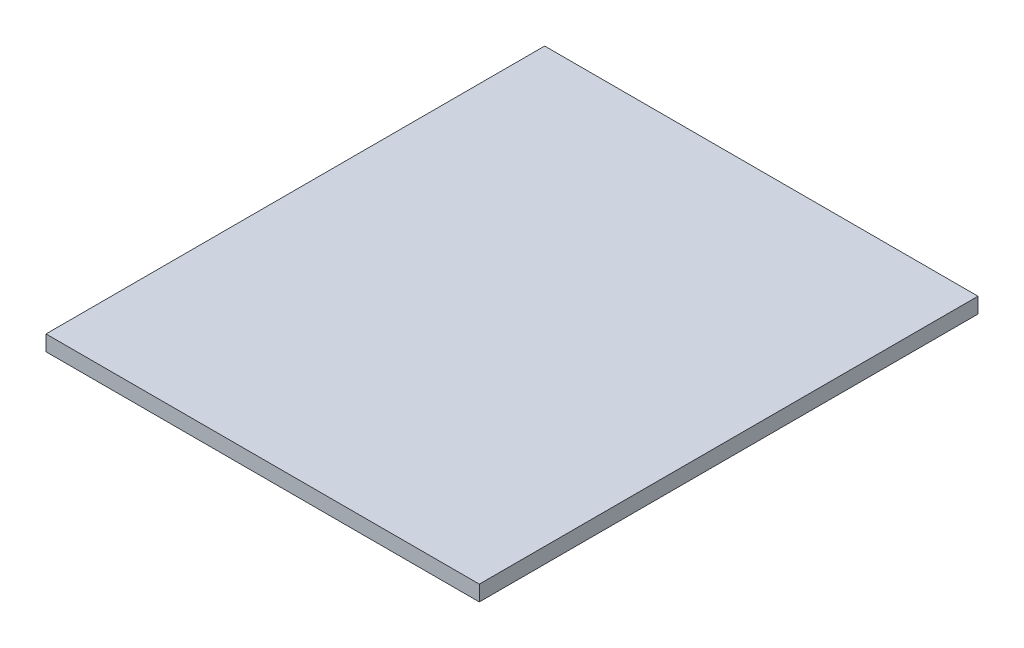
ISO-10303-21;
HEADER;
FILE_DESCRIPTION(('STEP AP214'),'2;1');
FILE_NAME('part.step','',(''),(''),'','','');
FILE_SCHEMA(('AUTOMOTIVE_DESIGN { 1 0 10303 214 1 1 1 1 }'));
ENDSEC;
DATA;
#1=APPLICATION_CONTEXT('core data for automotive mechanical design processes');
#2=APPLICATION_PROTOCOL_DEFINITION('international standard','automotive_design',2000,#1);
#3=PRODUCT_CONTEXT('',#1,'mechanical');
#4=PRODUCT('Part','Part','',(#3));
#5=PRODUCT_RELATED_PRODUCT_CATEGORY('part','',(#4));
#6=PRODUCT_DEFINITION_FORMATION('','',#4);
#7=PRODUCT_DEFINITION_CONTEXT('part definition',#1,'design');
#8=PRODUCT_DEFINITION('design','',#6,#7);
#9=PRODUCT_DEFINITION_SHAPE('','',#8);
#10=(LENGTH_UNIT() NAMED_UNIT(*) SI_UNIT(.MILLI.,.METRE.));
#11=(NAMED_UNIT(*) PLANE_ANGLE_UNIT() SI_UNIT($,.RADIAN.));
#12=(NAMED_UNIT(*) SI_UNIT($,.STERADIAN.) SOLID_ANGLE_UNIT());
#13=UNCERTAINTY_MEASURE_WITH_UNIT(LENGTH_MEASURE(1.E-05),#10,'distance_accuracy_value','');
#14=(GEOMETRIC_REPRESENTATION_CONTEXT(3) GLOBAL_UNCERTAINTY_ASSIGNED_CONTEXT((#13)) GLOBAL_UNIT_ASSIGNED_CONTEXT((#10,
#11,#12)) REPRESENTATION_CONTEXT('',''));
#15=CARTESIAN_POINT('',(0.,0.,0.));
#16=DIRECTION('',(0.,0.,1.));
#17=DIRECTION('',(1.,0.,0.));
#18=AXIS2_PLACEMENT_3D('',#15,#16,#17);
#19=CARTESIAN_POINT('',(63.,4.5,72.5));
#20=DIRECTION('',(-1.,0.,0.));
#21=DIRECTION('',(0.,0.,1.));
#22=AXIS2_PLACEMENT_3D('',#19,#20,#21);
#23=PLANE('',#22);
#24=DIRECTION('',(0.,0.,-1.));
#25=VECTOR('',#24,1.);
#26=CARTESIAN_POINT('',(63.,0.,72.5));
#27=LINE('',#26,#25);
#28=CARTESIAN_POINT('',(63.,0.,72.5));
#29=VERTEX_POINT('',#28);
#30=CARTESIAN_POINT('',(63.,0.,-72.5));
#31=VERTEX_POINT('',#30);
#32=EDGE_CURVE('E96',#29,#31,#27,.T.);
#33=ORIENTED_EDGE('',*,*,#32,.T.);
#34=DIRECTION('',(0.,-1.,0.));
#35=VECTOR('',#34,1.);
#36=CARTESIAN_POINT('',(63.,4.5,-72.5));
#37=LINE('',#36,#35);
#38=CARTESIAN_POINT('',(63.,4.5,-72.5));
#39=VERTEX_POINT('',#38);
#40=EDGE_CURVE('E11',#39,#31,#37,.T.);
#41=ORIENTED_EDGE('',*,*,#40,.F.);
#42=DIRECTION('',(0.,0.,-1.));
#43=VECTOR('',#42,1.);
#44=CARTESIAN_POINT('',(63.,4.5,72.5));
#45=LINE('',#44,#43);
#46=CARTESIAN_POINT('',(63.,4.5,72.5));
#47=VERTEX_POINT('',#46);
#48=EDGE_CURVE('E84',#47,#39,#45,.T.);
#49=ORIENTED_EDGE('',*,*,#48,.F.);
#50=DIRECTION('',(0.,-1.,0.));
#51=VECTOR('',#50,1.);
#52=CARTESIAN_POINT('',(63.,4.5,72.5));
#53=LINE('',#52,#51);
#54=EDGE_CURVE('E92',#47,#29,#53,.T.);
#55=ORIENTED_EDGE('',*,*,#54,.T.);
#56=EDGE_LOOP('',(#33,#41,#49,#55));
#57=FACE_BOUND('',#56,.T.);
#58=ADVANCED_FACE('F33',(#57),#23,.F.);
#59=CARTESIAN_POINT('',(-63.,4.5,-72.5));
#60=DIRECTION('',(0.,0.,1.));
#61=DIRECTION('',(1.,0.,0.));
#62=AXIS2_PLACEMENT_3D('',#59,#60,#61);
#63=PLANE('',#62);
#64=DIRECTION('',(-1.,0.,0.));
#65=VECTOR('',#64,1.);
#66=CARTESIAN_POINT('',(-63.,0.,-72.5));
#67=LINE('',#66,#65);
#68=CARTESIAN_POINT('',(-63.,0.,-72.5));
#69=VERTEX_POINT('',#68);
#70=EDGE_CURVE('E88',#31,#69,#67,.T.);
#71=ORIENTED_EDGE('',*,*,#70,.T.);
#72=DIRECTION('',(0.,-1.,0.));
#73=VECTOR('',#72,1.);
#74=CARTESIAN_POINT('',(-63.,4.5,-72.5));
#75=LINE('',#74,#73);
#76=CARTESIAN_POINT('',(-63.,4.5,-72.5));
#77=VERTEX_POINT('',#76);
#78=EDGE_CURVE('E41',#77,#69,#75,.T.);
#79=ORIENTED_EDGE('',*,*,#78,.F.);
#80=DIRECTION('',(-1.,0.,0.));
#81=VECTOR('',#80,1.);
#82=CARTESIAN_POINT('',(-63.,4.5,-72.5));
#83=LINE('',#82,#81);
#84=EDGE_CURVE('E79',#39,#77,#83,.T.);
#85=ORIENTED_EDGE('',*,*,#84,.F.);
#86=ORIENTED_EDGE('',*,*,#40,.T.);
#87=EDGE_LOOP('',(#71,#79,#85,#86));
#88=FACE_BOUND('',#87,.T.);
#89=ADVANCED_FACE('F87',(#88),#63,.F.);
#90=CARTESIAN_POINT('',(-63.,4.5,72.5));
#91=DIRECTION('',(1.,0.,0.));
#92=DIRECTION('',(0.,0.,-1.));
#93=AXIS2_PLACEMENT_3D('',#90,#91,#92);
#94=PLANE('',#93);
#95=DIRECTION('',(0.,0.,1.));
#96=VECTOR('',#95,1.);
#97=CARTESIAN_POINT('',(-63.,0.,72.5));
#98=LINE('',#97,#96);
#99=CARTESIAN_POINT('',(-63.,0.,72.5));
#100=VERTEX_POINT('',#99);
#101=EDGE_CURVE('E66',#69,#100,#98,.T.);
#102=ORIENTED_EDGE('',*,*,#101,.T.);
#103=DIRECTION('',(0.,-1.,0.));
#104=VECTOR('',#103,1.);
#105=CARTESIAN_POINT('',(-63.,4.5,72.5));
#106=LINE('',#105,#104);
#107=CARTESIAN_POINT('',(-63.,4.5,72.5));
#108=VERTEX_POINT('',#107);
#109=EDGE_CURVE('E89',#108,#100,#106,.T.);
#110=ORIENTED_EDGE('',*,*,#109,.F.);
#111=DIRECTION('',(0.,0.,1.));
#112=VECTOR('',#111,1.);
#113=CARTESIAN_POINT('',(-63.,4.5,72.5));
#114=LINE('',#113,#112);
#115=EDGE_CURVE('E82',#77,#108,#114,.T.);
#116=ORIENTED_EDGE('',*,*,#115,.F.);
#117=ORIENTED_EDGE('',*,*,#78,.T.);
#118=EDGE_LOOP('',(#102,#110,#116,#117));
#119=FACE_BOUND('',#118,.T.);
#120=ADVANCED_FACE('F90',(#119),#94,.F.);
#121=CARTESIAN_POINT('',(-63.,4.5,72.5));
#122=DIRECTION('',(0.,0.,-1.));
#123=DIRECTION('',(-1.,0.,0.));
#124=AXIS2_PLACEMENT_3D('',#121,#122,#123);
#125=PLANE('',#124);
#126=DIRECTION('',(1.,0.,0.));
#127=VECTOR('',#126,1.);
#128=CARTESIAN_POINT('',(-63.,0.,72.5));
#129=LINE('',#128,#127);
#130=EDGE_CURVE('E72',#100,#29,#129,.T.);
#131=ORIENTED_EDGE('',*,*,#130,.T.);
#132=ORIENTED_EDGE('',*,*,#54,.F.);
#133=DIRECTION('',(1.,0.,0.));
#134=VECTOR('',#133,1.);
#135=CARTESIAN_POINT('',(-63.,4.5,72.5));
#136=LINE('',#135,#134);
#137=EDGE_CURVE('E49',#108,#47,#136,.T.);
#138=ORIENTED_EDGE('',*,*,#137,.F.);
#139=ORIENTED_EDGE('',*,*,#109,.T.);
#140=EDGE_LOOP('',(#131,#132,#138,#139));
#141=FACE_BOUND('',#140,.T.);
#142=ADVANCED_FACE('F103',(#141),#125,.F.);
#143=CARTESIAN_POINT('',(0.,4.5,0.));
#144=DIRECTION('',(0.,-1.,0.));
#145=DIRECTION('',(0.,0.,-1.));
#146=AXIS2_PLACEMENT_3D('',#143,#144,#145);
#147=PLANE('',#146);
#148=ORIENTED_EDGE('',*,*,#48,.T.);
#149=ORIENTED_EDGE('',*,*,#84,.T.);
#150=ORIENTED_EDGE('',*,*,#115,.T.);
#151=ORIENTED_EDGE('',*,*,#137,.T.);
#152=EDGE_LOOP('',(#148,#149,#150,#151));
#153=FACE_BOUND('',#152,.T.);
#154=ADVANCED_FACE('F80',(#153),#147,.F.);
#155=CARTESIAN_POINT('',(0.,0.,0.));
#156=DIRECTION('',(0.,-1.,0.));
#157=DIRECTION('',(0.,0.,-1.));
#158=AXIS2_PLACEMENT_3D('',#155,#156,#157);
#159=PLANE('',#158);
#160=ORIENTED_EDGE('',*,*,#32,.F.);
#161=ORIENTED_EDGE('',*,*,#130,.F.);
#162=ORIENTED_EDGE('',*,*,#101,.F.);
#163=ORIENTED_EDGE('',*,*,#70,.F.);
#164=EDGE_LOOP('',(#160,#161,#162,#163));
#165=FACE_BOUND('',#164,.T.);
#166=ADVANCED_FACE('F106',(#165),#159,.T.);
#167=CLOSED_SHELL('',(#58,#89,#120,#142,#154,#166));
#168=MANIFOLD_SOLID_BREP('B2',#167);
#169=ADVANCED_BREP_SHAPE_REPRESENTATION('',(#18,#168),#14);
#170=SHAPE_DEFINITION_REPRESENTATION(#9,#169);
ENDSEC;
END-ISO-10303-21;
